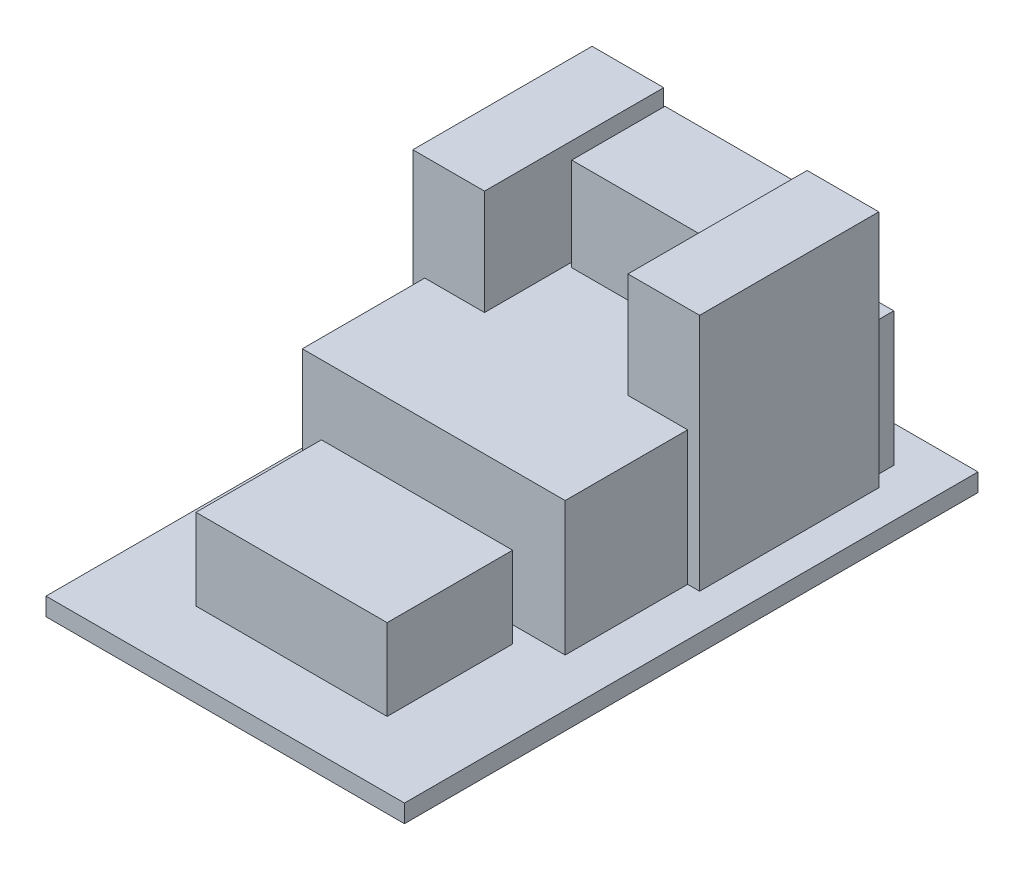
ISO-10303-21;
HEADER;
FILE_DESCRIPTION(('STEP AP214'),'2;1');
FILE_NAME('part.step','',(''),(''),'','','');
FILE_SCHEMA(('AUTOMOTIVE_DESIGN { 1 0 10303 214 1 1 1 1 }'));
ENDSEC;
DATA;
#1=APPLICATION_CONTEXT('core data for automotive mechanical design processes');
#2=APPLICATION_PROTOCOL_DEFINITION('international standard','automotive_design',2000,#1);
#3=PRODUCT_CONTEXT('',#1,'mechanical');
#4=PRODUCT('Part','Part','',(#3));
#5=PRODUCT_RELATED_PRODUCT_CATEGORY('part','',(#4));
#6=PRODUCT_DEFINITION_FORMATION('','',#4);
#7=PRODUCT_DEFINITION_CONTEXT('part definition',#1,'design');
#8=PRODUCT_DEFINITION('design','',#6,#7);
#9=PRODUCT_DEFINITION_SHAPE('','',#8);
#10=(LENGTH_UNIT() NAMED_UNIT(*) SI_UNIT(.MILLI.,.METRE.));
#11=(NAMED_UNIT(*) PLANE_ANGLE_UNIT() SI_UNIT($,.RADIAN.));
#12=(NAMED_UNIT(*) SI_UNIT($,.STERADIAN.) SOLID_ANGLE_UNIT());
#13=UNCERTAINTY_MEASURE_WITH_UNIT(LENGTH_MEASURE(1.E-05),#10,'distance_accuracy_value','');
#14=(GEOMETRIC_REPRESENTATION_CONTEXT(3) GLOBAL_UNCERTAINTY_ASSIGNED_CONTEXT((#13)) GLOBAL_UNIT_ASSIGNED_CONTEXT((#10,
#11,#12)) REPRESENTATION_CONTEXT('',''));
#15=CARTESIAN_POINT('',(0.,0.,0.));
#16=DIRECTION('',(0.,0.,1.));
#17=DIRECTION('',(1.,0.,0.));
#18=AXIS2_PLACEMENT_3D('',#15,#16,#17);
#19=CARTESIAN_POINT('',(0.,112.,0.));
#20=DIRECTION('',(0.,-1.,0.));
#21=DIRECTION('',(0.,0.,-1.));
#22=AXIS2_PLACEMENT_3D('',#19,#20,#21);
#23=PLANE('',#22);
#24=DIRECTION('',(-1.,0.,0.));
#25=VECTOR('',#24,1.);
#26=CARTESIAN_POINT('',(0.,112.,-187.));
#27=LINE('',#26,#25);
#28=CARTESIAN_POINT('',(110.,112.,-187.));
#29=VERTEX_POINT('',#28);
#30=CARTESIAN_POINT('',(60.,112.,-187.));
#31=VERTEX_POINT('',#30);
#32=EDGE_CURVE('E281',#29,#31,#27,.T.);
#33=ORIENTED_EDGE('',*,*,#32,.F.);
#34=DIRECTION('',(0.,0.,-1.));
#35=VECTOR('',#34,1.);
#36=CARTESIAN_POINT('',(110.,112.,65.5));
#37=LINE('',#36,#35);
#38=CARTESIAN_POINT('',(110.,112.,-209.5));
#39=VERTEX_POINT('',#38);
#40=EDGE_CURVE('E358',#29,#39,#37,.T.);
#41=ORIENTED_EDGE('',*,*,#40,.T.);
#42=DIRECTION('',(-1.,0.,0.));
#43=VECTOR('',#42,1.);
#44=CARTESIAN_POINT('',(-110.,112.,-209.5));
#45=LINE('',#44,#43);
#46=CARTESIAN_POINT('',(-110.,112.,-209.5));
#47=VERTEX_POINT('',#46);
#48=EDGE_CURVE('E357',#39,#47,#45,.T.);
#49=ORIENTED_EDGE('',*,*,#48,.T.);
#50=DIRECTION('',(0.,0.,1.));
#51=VECTOR('',#50,1.);
#52=CARTESIAN_POINT('',(-110.,112.,65.5));
#53=LINE('',#52,#51);
#54=CARTESIAN_POINT('',(-110.,112.,-187.));
#55=VERTEX_POINT('',#54);
#56=EDGE_CURVE('E361',#47,#55,#53,.T.);
#57=ORIENTED_EDGE('',*,*,#56,.T.);
#58=DIRECTION('',(-1.,0.,0.));
#59=VECTOR('',#58,1.);
#60=CARTESIAN_POINT('',(0.,112.,-187.));
#61=LINE('',#60,#59);
#62=CARTESIAN_POINT('',(-60.,112.,-187.));
#63=VERTEX_POINT('',#62);
#64=EDGE_CURVE('E428',#63,#55,#61,.T.);
#65=ORIENTED_EDGE('',*,*,#64,.F.);
#66=DIRECTION('',(0.,0.,-1.));
#67=VECTOR('',#66,1.);
#68=CARTESIAN_POINT('',(-60.,112.,0.));
#69=LINE('',#68,#67);
#70=CARTESIAN_POINT('',(-60.,112.,-37.));
#71=VERTEX_POINT('',#70);
#72=EDGE_CURVE('E425',#71,#63,#69,.T.);
#73=ORIENTED_EDGE('',*,*,#72,.F.);
#74=DIRECTION('',(1.,0.,0.));
#75=VECTOR('',#74,1.);
#76=CARTESIAN_POINT('',(0.,112.,-37.));
#77=LINE('',#76,#75);
#78=CARTESIAN_POINT('',(-110.,112.,-37.));
#79=VERTEX_POINT('',#78);
#80=EDGE_CURVE('E417',#79,#71,#77,.T.);
#81=ORIENTED_EDGE('',*,*,#80,.F.);
#82=CARTESIAN_POINT('',(-110.,112.,65.5));
#83=VERTEX_POINT('',#82);
#84=EDGE_CURVE('E360',#79,#83,#53,.T.);
#85=ORIENTED_EDGE('',*,*,#84,.T.);
#86=DIRECTION('',(1.,0.,0.));
#87=VECTOR('',#86,1.);
#88=CARTESIAN_POINT('',(-110.,112.,65.5));
#89=LINE('',#88,#87);
#90=CARTESIAN_POINT('',(110.,112.,65.5));
#91=VERTEX_POINT('',#90);
#92=EDGE_CURVE('E364',#83,#91,#89,.T.);
#93=ORIENTED_EDGE('',*,*,#92,.T.);
#94=CARTESIAN_POINT('',(110.,112.,-37.));
#95=VERTEX_POINT('',#94);
#96=EDGE_CURVE('E354',#91,#95,#37,.T.);
#97=ORIENTED_EDGE('',*,*,#96,.T.);
#98=DIRECTION('',(1.,0.,0.));
#99=VECTOR('',#98,1.);
#100=CARTESIAN_POINT('',(0.,112.,-37.));
#101=LINE('',#100,#99);
#102=CARTESIAN_POINT('',(60.,112.,-37.));
#103=VERTEX_POINT('',#102);
#104=EDGE_CURVE('E278',#103,#95,#101,.T.);
#105=ORIENTED_EDGE('',*,*,#104,.F.);
#106=DIRECTION('',(0.,0.,1.));
#107=VECTOR('',#106,1.);
#108=CARTESIAN_POINT('',(60.,112.,0.));
#109=LINE('',#108,#107);
#110=EDGE_CURVE('E437',#31,#103,#109,.T.);
#111=ORIENTED_EDGE('',*,*,#110,.F.);
#112=EDGE_LOOP('',(#33,#41,#49,#57,#65,#73,#81,#85,#93,#97,#105,#111));
#113=FACE_BOUND('',#112,.T.);
#114=DIRECTION('',(0.,0.,-1.));
#115=VECTOR('',#114,1.);
#116=CARTESIAN_POINT('',(56.,112.,0.));
#117=LINE('',#116,#115);
#118=CARTESIAN_POINT('',(56.,112.,-106.));
#119=VERTEX_POINT('',#118);
#120=CARTESIAN_POINT('',(56.,112.,-184.));
#121=VERTEX_POINT('',#120);
#122=EDGE_CURVE('E11',#119,#121,#117,.T.);
#123=ORIENTED_EDGE('',*,*,#122,.F.);
#124=DIRECTION('',(1.,0.,0.));
#125=VECTOR('',#124,1.);
#126=CARTESIAN_POINT('',(0.,112.,-106.));
#127=LINE('',#126,#125);
#128=CARTESIAN_POINT('',(-56.,112.,-106.));
#129=VERTEX_POINT('',#128);
#130=EDGE_CURVE('E440',#129,#119,#127,.T.);
#131=ORIENTED_EDGE('',*,*,#130,.F.);
#132=DIRECTION('',(0.,0.,1.));
#133=VECTOR('',#132,1.);
#134=CARTESIAN_POINT('',(-56.,112.,0.));
#135=LINE('',#134,#133);
#136=CARTESIAN_POINT('',(-56.,112.,-184.));
#137=VERTEX_POINT('',#136);
#138=EDGE_CURVE('E59',#137,#129,#135,.T.);
#139=ORIENTED_EDGE('',*,*,#138,.F.);
#140=DIRECTION('',(-1.,0.,0.));
#141=VECTOR('',#140,1.);
#142=CARTESIAN_POINT('',(0.,112.,-184.));
#143=LINE('',#142,#141);
#144=EDGE_CURVE('E49',#121,#137,#143,.T.);
#145=ORIENTED_EDGE('',*,*,#144,.F.);
#146=EDGE_LOOP('',(#123,#131,#139,#145));
#147=FACE_BOUND('',#146,.T.);
#148=ADVANCED_FACE('F41',(#113,#147),#23,.F.);
#149=CARTESIAN_POINT('',(0.,0.,0.));
#150=DIRECTION('',(0.,-1.,0.));
#151=DIRECTION('',(0.,0.,-1.));
#152=AXIS2_PLACEMENT_3D('',#149,#150,#151);
#153=PLANE('',#152);
#154=DIRECTION('',(0.,0.,-1.));
#155=VECTOR('',#154,1.);
#156=CARTESIAN_POINT('',(150.,0.,240.));
#157=LINE('',#156,#155);
#158=CARTESIAN_POINT('',(150.,0.,240.));
#159=VERTEX_POINT('',#158);
#160=CARTESIAN_POINT('',(150.,0.,-240.));
#161=VERTEX_POINT('',#160);
#162=EDGE_CURVE('E390',#159,#161,#157,.T.);
#163=ORIENTED_EDGE('',*,*,#162,.T.);
#164=DIRECTION('',(-1.,0.,0.));
#165=VECTOR('',#164,1.);
#166=CARTESIAN_POINT('',(-150.,0.,-240.));
#167=LINE('',#166,#165);
#168=CARTESIAN_POINT('',(-150.,0.,-240.));
#169=VERTEX_POINT('',#168);
#170=EDGE_CURVE('E407',#161,#169,#167,.T.);
#171=ORIENTED_EDGE('',*,*,#170,.T.);
#172=DIRECTION('',(0.,0.,1.));
#173=VECTOR('',#172,1.);
#174=CARTESIAN_POINT('',(-150.,0.,240.));
#175=LINE('',#174,#173);
#176=CARTESIAN_POINT('',(-150.,0.,240.));
#177=VERTEX_POINT('',#176);
#178=EDGE_CURVE('E410',#169,#177,#175,.T.);
#179=ORIENTED_EDGE('',*,*,#178,.T.);
#180=DIRECTION('',(1.,0.,0.));
#181=VECTOR('',#180,1.);
#182=CARTESIAN_POINT('',(-150.,0.,240.));
#183=LINE('',#182,#181);
#184=EDGE_CURVE('E395',#177,#159,#183,.T.);
#185=ORIENTED_EDGE('',*,*,#184,.T.);
#186=EDGE_LOOP('',(#163,#171,#179,#185));
#187=FACE_BOUND('',#186,.T.);
#188=DIRECTION('',(0.,0.,-1.));
#189=VECTOR('',#188,1.);
#190=CARTESIAN_POINT('',(80.,0.,184.5));
#191=LINE('',#190,#189);
#192=CARTESIAN_POINT('',(80.,0.,184.5));
#193=VERTEX_POINT('',#192);
#194=CARTESIAN_POINT('',(80.,0.,79.5));
#195=VERTEX_POINT('',#194);
#196=EDGE_CURVE('E320',#193,#195,#191,.T.);
#197=ORIENTED_EDGE('',*,*,#196,.F.);
#198=DIRECTION('',(1.,0.,0.));
#199=VECTOR('',#198,1.);
#200=CARTESIAN_POINT('',(-80.,0.,184.5));
#201=LINE('',#200,#199);
#202=CARTESIAN_POINT('',(-80.,0.,184.5));
#203=VERTEX_POINT('',#202);
#204=EDGE_CURVE('E325',#203,#193,#201,.T.);
#205=ORIENTED_EDGE('',*,*,#204,.F.);
#206=DIRECTION('',(0.,0.,1.));
#207=VECTOR('',#206,1.);
#208=CARTESIAN_POINT('',(-80.,0.,184.5));
#209=LINE('',#208,#207);
#210=CARTESIAN_POINT('',(-80.,0.,79.5));
#211=VERTEX_POINT('',#210);
#212=EDGE_CURVE('E337',#211,#203,#209,.T.);
#213=ORIENTED_EDGE('',*,*,#212,.F.);
#214=DIRECTION('',(-1.,0.,0.));
#215=VECTOR('',#214,1.);
#216=CARTESIAN_POINT('',(-80.,0.,79.5));
#217=LINE('',#216,#215);
#218=EDGE_CURVE('E334',#195,#211,#217,.T.);
#219=ORIENTED_EDGE('',*,*,#218,.F.);
#220=EDGE_LOOP('',(#197,#205,#213,#219));
#221=FACE_BOUND('',#220,.T.);
#222=DIRECTION('',(-1.,0.,0.));
#223=VECTOR('',#222,1.);
#224=CARTESIAN_POINT('',(60.,0.,-187.));
#225=LINE('',#224,#223);
#226=CARTESIAN_POINT('',(120.,0.,-187.));
#227=VERTEX_POINT('',#226);
#228=CARTESIAN_POINT('',(110.,0.,-187.));
#229=VERTEX_POINT('',#228);
#230=EDGE_CURVE('E246',#227,#229,#225,.T.);
#231=ORIENTED_EDGE('',*,*,#230,.F.);
#232=DIRECTION('',(0.,0.,-1.));
#233=VECTOR('',#232,1.);
#234=CARTESIAN_POINT('',(120.,0.,-37.));
#235=LINE('',#234,#233);
#236=CARTESIAN_POINT('',(120.,0.,-37.));
#237=VERTEX_POINT('',#236);
#238=EDGE_CURVE('E243',#237,#227,#235,.T.);
#239=ORIENTED_EDGE('',*,*,#238,.F.);
#240=DIRECTION('',(1.,0.,0.));
#241=VECTOR('',#240,1.);
#242=CARTESIAN_POINT('',(60.,0.,-37.));
#243=LINE('',#242,#241);
#244=CARTESIAN_POINT('',(110.,0.,-37.));
#245=VERTEX_POINT('',#244);
#246=EDGE_CURVE('E256',#245,#237,#243,.T.);
#247=ORIENTED_EDGE('',*,*,#246,.F.);
#248=DIRECTION('',(0.,0.,-1.));
#249=VECTOR('',#248,1.);
#250=CARTESIAN_POINT('',(110.,0.,65.5));
#251=LINE('',#250,#249);
#252=CARTESIAN_POINT('',(110.,0.,65.5));
#253=VERTEX_POINT('',#252);
#254=EDGE_CURVE('E367',#253,#245,#251,.T.);
#255=ORIENTED_EDGE('',*,*,#254,.F.);
#256=DIRECTION('',(1.,0.,0.));
#257=VECTOR('',#256,1.);
#258=CARTESIAN_POINT('',(-110.,0.,65.5));
#259=LINE('',#258,#257);
#260=CARTESIAN_POINT('',(-110.,0.,65.5));
#261=VERTEX_POINT('',#260);
#262=EDGE_CURVE('E376',#261,#253,#259,.T.);
#263=ORIENTED_EDGE('',*,*,#262,.F.);
#264=DIRECTION('',(0.,0.,1.));
#265=VECTOR('',#264,1.);
#266=CARTESIAN_POINT('',(-110.,0.,65.5));
#267=LINE('',#266,#265);
#268=CARTESIAN_POINT('',(-110.,0.,-37.));
#269=VERTEX_POINT('',#268);
#270=EDGE_CURVE('E372',#269,#261,#267,.T.);
#271=ORIENTED_EDGE('',*,*,#270,.F.);
#272=DIRECTION('',(1.,0.,0.));
#273=VECTOR('',#272,1.);
#274=CARTESIAN_POINT('',(-120.,0.,-37.));
#275=LINE('',#274,#273);
#276=CARTESIAN_POINT('',(-120.,0.,-37.));
#277=VERTEX_POINT('',#276);
#278=EDGE_CURVE('E289',#277,#269,#275,.T.);
#279=ORIENTED_EDGE('',*,*,#278,.F.);
#280=DIRECTION('',(0.,0.,1.));
#281=VECTOR('',#280,1.);
#282=CARTESIAN_POINT('',(-120.,0.,-37.));
#283=LINE('',#282,#281);
#284=CARTESIAN_POINT('',(-120.,0.,-187.));
#285=VERTEX_POINT('',#284);
#286=EDGE_CURVE('E298',#285,#277,#283,.T.);
#287=ORIENTED_EDGE('',*,*,#286,.F.);
#288=DIRECTION('',(-1.,0.,0.));
#289=VECTOR('',#288,1.);
#290=CARTESIAN_POINT('',(-120.,0.,-187.));
#291=LINE('',#290,#289);
#292=CARTESIAN_POINT('',(-110.,0.,-187.));
#293=VERTEX_POINT('',#292);
#294=EDGE_CURVE('E284',#293,#285,#291,.T.);
#295=ORIENTED_EDGE('',*,*,#294,.F.);
#296=CARTESIAN_POINT('',(-110.,0.,-209.5));
#297=VERTEX_POINT('',#296);
#298=EDGE_CURVE('E373',#297,#293,#267,.T.);
#299=ORIENTED_EDGE('',*,*,#298,.F.);
#300=DIRECTION('',(-1.,0.,0.));
#301=VECTOR('',#300,1.);
#302=CARTESIAN_POINT('',(-110.,0.,-209.5));
#303=LINE('',#302,#301);
#304=CARTESIAN_POINT('',(110.,0.,-209.5));
#305=VERTEX_POINT('',#304);
#306=EDGE_CURVE('E369',#305,#297,#303,.T.);
#307=ORIENTED_EDGE('',*,*,#306,.F.);
#308=EDGE_CURVE('E353',#229,#305,#251,.T.);
#309=ORIENTED_EDGE('',*,*,#308,.F.);
#310=EDGE_LOOP('',(#231,#239,#247,#255,#263,#271,#279,#287,#295,#299,#307,#309));
#311=FACE_BOUND('',#310,.T.);
#312=ADVANCED_FACE('F454',(#187,#221,#311),#153,.F.);
#313=CARTESIAN_POINT('',(110.,112.,65.5));
#314=DIRECTION('',(-1.,0.,0.));
#315=DIRECTION('',(0.,0.,1.));
#316=AXIS2_PLACEMENT_3D('',#313,#314,#315);
#317=PLANE('',#316);
#318=DIRECTION('',(0.,1.,0.));
#319=VECTOR('',#318,1.);
#320=CARTESIAN_POINT('',(110.,112.,-187.));
#321=LINE('',#320,#319);
#322=EDGE_CURVE('E434',#229,#29,#321,.T.);
#323=ORIENTED_EDGE('',*,*,#322,.F.);
#324=ORIENTED_EDGE('',*,*,#308,.T.);
#325=DIRECTION('',(0.,-1.,0.));
#326=VECTOR('',#325,1.);
#327=CARTESIAN_POINT('',(110.,112.,-209.5));
#328=LINE('',#327,#326);
#329=EDGE_CURVE('E387',#39,#305,#328,.T.);
#330=ORIENTED_EDGE('',*,*,#329,.F.);
#331=ORIENTED_EDGE('',*,*,#40,.F.);
#332=EDGE_LOOP('',(#323,#324,#330,#331));
#333=FACE_BOUND('',#332,.T.);
#334=ADVANCED_FACE('F462',(#333),#317,.F.);
#335=DIRECTION('',(0.,-1.,0.));
#336=VECTOR('',#335,1.);
#337=CARTESIAN_POINT('',(110.,112.,-37.));
#338=LINE('',#337,#336);
#339=EDGE_CURVE('E431',#95,#245,#338,.T.);
#340=ORIENTED_EDGE('',*,*,#339,.F.);
#341=ORIENTED_EDGE('',*,*,#96,.F.);
#342=DIRECTION('',(0.,-1.,0.));
#343=VECTOR('',#342,1.);
#344=CARTESIAN_POINT('',(110.,112.,65.5));
#345=LINE('',#344,#343);
#346=EDGE_CURVE('E366',#91,#253,#345,.T.);
#347=ORIENTED_EDGE('',*,*,#346,.T.);
#348=ORIENTED_EDGE('',*,*,#254,.T.);
#349=EDGE_LOOP('',(#340,#341,#347,#348));
#350=FACE_BOUND('',#349,.T.);
#351=ADVANCED_FACE('F478',(#350),#317,.F.);
#352=CARTESIAN_POINT('',(-110.,112.,65.5));
#353=DIRECTION('',(1.,0.,0.));
#354=DIRECTION('',(0.,0.,-1.));
#355=AXIS2_PLACEMENT_3D('',#352,#353,#354);
#356=PLANE('',#355);
#357=DIRECTION('',(0.,-1.,0.));
#358=VECTOR('',#357,1.);
#359=CARTESIAN_POINT('',(-110.,112.,-187.));
#360=LINE('',#359,#358);
#361=EDGE_CURVE('E317',#55,#293,#360,.T.);
#362=ORIENTED_EDGE('',*,*,#361,.F.);
#363=ORIENTED_EDGE('',*,*,#56,.F.);
#364=DIRECTION('',(0.,-1.,0.));
#365=VECTOR('',#364,1.);
#366=CARTESIAN_POINT('',(-110.,112.,-209.5));
#367=LINE('',#366,#365);
#368=EDGE_CURVE('E384',#47,#297,#367,.T.);
#369=ORIENTED_EDGE('',*,*,#368,.T.);
#370=ORIENTED_EDGE('',*,*,#298,.T.);
#371=EDGE_LOOP('',(#362,#363,#369,#370));
#372=FACE_BOUND('',#371,.T.);
#373=ADVANCED_FACE('F474',(#372),#356,.F.);
#374=DIRECTION('',(0.,1.,0.));
#375=VECTOR('',#374,1.);
#376=CARTESIAN_POINT('',(-110.,112.,-37.));
#377=LINE('',#376,#375);
#378=EDGE_CURVE('E314',#269,#79,#377,.T.);
#379=ORIENTED_EDGE('',*,*,#378,.F.);
#380=ORIENTED_EDGE('',*,*,#270,.T.);
#381=DIRECTION('',(0.,-1.,0.));
#382=VECTOR('',#381,1.);
#383=CARTESIAN_POINT('',(-110.,112.,65.5));
#384=LINE('',#383,#382);
#385=EDGE_CURVE('E381',#83,#261,#384,.T.);
#386=ORIENTED_EDGE('',*,*,#385,.F.);
#387=ORIENTED_EDGE('',*,*,#84,.F.);
#388=EDGE_LOOP('',(#379,#380,#386,#387));
#389=FACE_BOUND('',#388,.T.);
#390=ADVANCED_FACE('F477',(#389),#356,.F.);
#391=CARTESIAN_POINT('',(150.,-15.,240.));
#392=DIRECTION('',(1.,0.,0.));
#393=DIRECTION('',(0.,0.,-1.));
#394=AXIS2_PLACEMENT_3D('',#391,#392,#393);
#395=PLANE('',#394);
#396=ORIENTED_EDGE('',*,*,#162,.F.);
#397=DIRECTION('',(0.,1.,0.));
#398=VECTOR('',#397,1.);
#399=CARTESIAN_POINT('',(150.,-15.,240.));
#400=LINE('',#399,#398);
#401=CARTESIAN_POINT('',(150.,-15.,240.));
#402=VERTEX_POINT('',#401);
#403=EDGE_CURVE('E415',#402,#159,#400,.T.);
#404=ORIENTED_EDGE('',*,*,#403,.F.);
#405=DIRECTION('',(0.,0.,-1.));
#406=VECTOR('',#405,1.);
#407=CARTESIAN_POINT('',(150.,-15.,240.));
#408=LINE('',#407,#406);
#409=CARTESIAN_POINT('',(150.,-15.,-240.));
#410=VERTEX_POINT('',#409);
#411=EDGE_CURVE('E391',#402,#410,#408,.T.);
#412=ORIENTED_EDGE('',*,*,#411,.T.);
#413=DIRECTION('',(0.,1.,0.));
#414=VECTOR('',#413,1.);
#415=CARTESIAN_POINT('',(150.,-15.,-240.));
#416=LINE('',#415,#414);
#417=EDGE_CURVE('E404',#410,#161,#416,.T.);
#418=ORIENTED_EDGE('',*,*,#417,.T.);
#419=EDGE_LOOP('',(#396,#404,#412,#418));
#420=FACE_BOUND('',#419,.T.);
#421=ADVANCED_FACE('F43',(#420),#395,.T.);
#422=CARTESIAN_POINT('',(-150.,-15.,240.));
#423=DIRECTION('',(0.,0.,1.));
#424=DIRECTION('',(1.,0.,0.));
#425=AXIS2_PLACEMENT_3D('',#422,#423,#424);
#426=PLANE('',#425);
#427=ORIENTED_EDGE('',*,*,#184,.F.);
#428=DIRECTION('',(0.,1.,0.));
#429=VECTOR('',#428,1.);
#430=CARTESIAN_POINT('',(-150.,-15.,240.));
#431=LINE('',#430,#429);
#432=CARTESIAN_POINT('',(-150.,-15.,240.));
#433=VERTEX_POINT('',#432);
#434=EDGE_CURVE('E418',#433,#177,#431,.T.);
#435=ORIENTED_EDGE('',*,*,#434,.F.);
#436=DIRECTION('',(1.,0.,0.));
#437=VECTOR('',#436,1.);
#438=CARTESIAN_POINT('',(-150.,-15.,240.));
#439=LINE('',#438,#437);
#440=EDGE_CURVE('E401',#433,#402,#439,.T.);
#441=ORIENTED_EDGE('',*,*,#440,.T.);
#442=ORIENTED_EDGE('',*,*,#403,.T.);
#443=EDGE_LOOP('',(#427,#435,#441,#442));
#444=FACE_BOUND('',#443,.T.);
#445=ADVANCED_FACE('F491',(#444),#426,.T.);
#446=CARTESIAN_POINT('',(-150.,-15.,240.));
#447=DIRECTION('',(-1.,0.,0.));
#448=DIRECTION('',(0.,0.,1.));
#449=AXIS2_PLACEMENT_3D('',#446,#447,#448);
#450=PLANE('',#449);
#451=ORIENTED_EDGE('',*,*,#178,.F.);
#452=DIRECTION('',(0.,1.,0.));
#453=VECTOR('',#452,1.);
#454=CARTESIAN_POINT('',(-150.,-15.,-240.));
#455=LINE('',#454,#453);
#456=CARTESIAN_POINT('',(-150.,-15.,-240.));
#457=VERTEX_POINT('',#456);
#458=EDGE_CURVE('E420',#457,#169,#455,.T.);
#459=ORIENTED_EDGE('',*,*,#458,.F.);
#460=DIRECTION('',(0.,0.,1.));
#461=VECTOR('',#460,1.);
#462=CARTESIAN_POINT('',(-150.,-15.,240.));
#463=LINE('',#462,#461);
#464=EDGE_CURVE('E398',#457,#433,#463,.T.);
#465=ORIENTED_EDGE('',*,*,#464,.T.);
#466=ORIENTED_EDGE('',*,*,#434,.T.);
#467=EDGE_LOOP('',(#451,#459,#465,#466));
#468=FACE_BOUND('',#467,.T.);
#469=ADVANCED_FACE('F494',(#468),#450,.T.);
#470=CARTESIAN_POINT('',(-150.,-15.,-240.));
#471=DIRECTION('',(0.,0.,-1.));
#472=DIRECTION('',(-1.,0.,0.));
#473=AXIS2_PLACEMENT_3D('',#470,#471,#472);
#474=PLANE('',#473);
#475=ORIENTED_EDGE('',*,*,#170,.F.);
#476=ORIENTED_EDGE('',*,*,#417,.F.);
#477=DIRECTION('',(-1.,0.,0.));
#478=VECTOR('',#477,1.);
#479=CARTESIAN_POINT('',(-150.,-15.,-240.));
#480=LINE('',#479,#478);
#481=EDGE_CURVE('E394',#410,#457,#480,.T.);
#482=ORIENTED_EDGE('',*,*,#481,.T.);
#483=ORIENTED_EDGE('',*,*,#458,.T.);
#484=EDGE_LOOP('',(#475,#476,#482,#483));
#485=FACE_BOUND('',#484,.T.);
#486=ADVANCED_FACE('F488',(#485),#474,.T.);
#487=CARTESIAN_POINT('',(0.,-15.,0.));
#488=DIRECTION('',(0.,-1.,0.));
#489=DIRECTION('',(0.,0.,-1.));
#490=AXIS2_PLACEMENT_3D('',#487,#488,#489);
#491=PLANE('',#490);
#492=ORIENTED_EDGE('',*,*,#411,.F.);
#493=ORIENTED_EDGE('',*,*,#440,.F.);
#494=ORIENTED_EDGE('',*,*,#464,.F.);
#495=ORIENTED_EDGE('',*,*,#481,.F.);
#496=EDGE_LOOP('',(#492,#493,#494,#495));
#497=FACE_BOUND('',#496,.T.);
#498=ADVANCED_FACE('F482',(#497),#491,.T.);
#499=CARTESIAN_POINT('',(-110.,112.,-209.5));
#500=DIRECTION('',(0.,0.,1.));
#501=DIRECTION('',(1.,0.,0.));
#502=AXIS2_PLACEMENT_3D('',#499,#500,#501);
#503=PLANE('',#502);
#504=ORIENTED_EDGE('',*,*,#306,.T.);
#505=ORIENTED_EDGE('',*,*,#368,.F.);
#506=ORIENTED_EDGE('',*,*,#48,.F.);
#507=ORIENTED_EDGE('',*,*,#329,.T.);
#508=EDGE_LOOP('',(#504,#505,#506,#507));
#509=FACE_BOUND('',#508,.T.);
#510=ADVANCED_FACE('F472',(#509),#503,.F.);
#511=CARTESIAN_POINT('',(-110.,112.,65.5));
#512=DIRECTION('',(0.,0.,-1.));
#513=DIRECTION('',(-1.,0.,0.));
#514=AXIS2_PLACEMENT_3D('',#511,#512,#513);
#515=PLANE('',#514);
#516=ORIENTED_EDGE('',*,*,#262,.T.);
#517=ORIENTED_EDGE('',*,*,#346,.F.);
#518=ORIENTED_EDGE('',*,*,#92,.F.);
#519=ORIENTED_EDGE('',*,*,#385,.T.);
#520=EDGE_LOOP('',(#516,#517,#518,#519));
#521=FACE_BOUND('',#520,.T.);
#522=ADVANCED_FACE('F469',(#521),#515,.F.);
#523=CARTESIAN_POINT('',(80.,68.,184.5));
#524=DIRECTION('',(-1.,0.,0.));
#525=DIRECTION('',(0.,0.,1.));
#526=AXIS2_PLACEMENT_3D('',#523,#524,#525);
#527=PLANE('',#526);
#528=ORIENTED_EDGE('',*,*,#196,.T.);
#529=DIRECTION('',(0.,-1.,0.));
#530=VECTOR('',#529,1.);
#531=CARTESIAN_POINT('',(80.,68.,79.5));
#532=LINE('',#531,#530);
#533=CARTESIAN_POINT('',(80.,68.,79.5));
#534=VERTEX_POINT('',#533);
#535=EDGE_CURVE('E350',#534,#195,#532,.T.);
#536=ORIENTED_EDGE('',*,*,#535,.F.);
#537=DIRECTION('',(0.,0.,-1.));
#538=VECTOR('',#537,1.);
#539=CARTESIAN_POINT('',(80.,68.,184.5));
#540=LINE('',#539,#538);
#541=CARTESIAN_POINT('',(80.,68.,184.5));
#542=VERTEX_POINT('',#541);
#543=EDGE_CURVE('E321',#542,#534,#540,.T.);
#544=ORIENTED_EDGE('',*,*,#543,.F.);
#545=DIRECTION('',(0.,-1.,0.));
#546=VECTOR('',#545,1.);
#547=CARTESIAN_POINT('',(80.,68.,184.5));
#548=LINE('',#547,#546);
#549=EDGE_CURVE('E331',#542,#193,#548,.T.);
#550=ORIENTED_EDGE('',*,*,#549,.T.);
#551=EDGE_LOOP('',(#528,#536,#544,#550));
#552=FACE_BOUND('',#551,.T.);
#553=ADVANCED_FACE('F467',(#552),#527,.F.);
#554=CARTESIAN_POINT('',(-80.,68.,79.5));
#555=DIRECTION('',(0.,0.,1.));
#556=DIRECTION('',(1.,0.,0.));
#557=AXIS2_PLACEMENT_3D('',#554,#555,#556);
#558=PLANE('',#557);
#559=ORIENTED_EDGE('',*,*,#218,.T.);
#560=DIRECTION('',(0.,-1.,0.));
#561=VECTOR('',#560,1.);
#562=CARTESIAN_POINT('',(-80.,68.,79.5));
#563=LINE('',#562,#561);
#564=CARTESIAN_POINT('',(-80.,68.,79.5));
#565=VERTEX_POINT('',#564);
#566=EDGE_CURVE('E347',#565,#211,#563,.T.);
#567=ORIENTED_EDGE('',*,*,#566,.F.);
#568=DIRECTION('',(-1.,0.,0.));
#569=VECTOR('',#568,1.);
#570=CARTESIAN_POINT('',(-80.,68.,79.5));
#571=LINE('',#570,#569);
#572=EDGE_CURVE('E324',#534,#565,#571,.T.);
#573=ORIENTED_EDGE('',*,*,#572,.F.);
#574=ORIENTED_EDGE('',*,*,#535,.T.);
#575=EDGE_LOOP('',(#559,#567,#573,#574));
#576=FACE_BOUND('',#575,.T.);
#577=ADVANCED_FACE('F593',(#576),#558,.F.);
#578=CARTESIAN_POINT('',(-80.,68.,184.5));
#579=DIRECTION('',(1.,0.,0.));
#580=DIRECTION('',(0.,0.,-1.));
#581=AXIS2_PLACEMENT_3D('',#578,#579,#580);
#582=PLANE('',#581);
#583=ORIENTED_EDGE('',*,*,#212,.T.);
#584=DIRECTION('',(0.,-1.,0.));
#585=VECTOR('',#584,1.);
#586=CARTESIAN_POINT('',(-80.,68.,184.5));
#587=LINE('',#586,#585);
#588=CARTESIAN_POINT('',(-80.,68.,184.5));
#589=VERTEX_POINT('',#588);
#590=EDGE_CURVE('E344',#589,#203,#587,.T.);
#591=ORIENTED_EDGE('',*,*,#590,.F.);
#592=DIRECTION('',(0.,0.,1.));
#593=VECTOR('',#592,1.);
#594=CARTESIAN_POINT('',(-80.,68.,184.5));
#595=LINE('',#594,#593);
#596=EDGE_CURVE('E327',#565,#589,#595,.T.);
#597=ORIENTED_EDGE('',*,*,#596,.F.);
#598=ORIENTED_EDGE('',*,*,#566,.T.);
#599=EDGE_LOOP('',(#583,#591,#597,#598));
#600=FACE_BOUND('',#599,.T.);
#601=ADVANCED_FACE('F590',(#600),#582,.F.);
#602=CARTESIAN_POINT('',(-80.,68.,184.5));
#603=DIRECTION('',(0.,0.,-1.));
#604=DIRECTION('',(-1.,0.,0.));
#605=AXIS2_PLACEMENT_3D('',#602,#603,#604);
#606=PLANE('',#605);
#607=ORIENTED_EDGE('',*,*,#204,.T.);
#608=ORIENTED_EDGE('',*,*,#549,.F.);
#609=DIRECTION('',(1.,0.,0.));
#610=VECTOR('',#609,1.);
#611=CARTESIAN_POINT('',(-80.,68.,184.5));
#612=LINE('',#611,#610);
#613=EDGE_CURVE('E329',#589,#542,#612,.T.);
#614=ORIENTED_EDGE('',*,*,#613,.F.);
#615=ORIENTED_EDGE('',*,*,#590,.T.);
#616=EDGE_LOOP('',(#607,#608,#614,#615));
#617=FACE_BOUND('',#616,.T.);
#618=ADVANCED_FACE('F586',(#617),#606,.F.);
#619=CARTESIAN_POINT('',(0.,68.,0.));
#620=DIRECTION('',(0.,-1.,0.));
#621=DIRECTION('',(0.,0.,-1.));
#622=AXIS2_PLACEMENT_3D('',#619,#620,#621);
#623=PLANE('',#622);
#624=ORIENTED_EDGE('',*,*,#543,.T.);
#625=ORIENTED_EDGE('',*,*,#572,.T.);
#626=ORIENTED_EDGE('',*,*,#596,.T.);
#627=ORIENTED_EDGE('',*,*,#613,.T.);
#628=EDGE_LOOP('',(#624,#625,#626,#627));
#629=FACE_BOUND('',#628,.T.);
#630=ADVANCED_FACE('F583',(#629),#623,.F.);
#631=CARTESIAN_POINT('',(-60.,200.,-37.));
#632=DIRECTION('',(-1.,0.,0.));
#633=DIRECTION('',(0.,0.,1.));
#634=AXIS2_PLACEMENT_3D('',#631,#632,#633);
#635=PLANE('',#634);
#636=DIRECTION('',(0.,-1.,0.));
#637=VECTOR('',#636,1.);
#638=CARTESIAN_POINT('',(-60.,200.,-37.));
#639=LINE('',#638,#637);
#640=CARTESIAN_POINT('',(-60.,200.,-37.));
#641=VERTEX_POINT('',#640);
#642=EDGE_CURVE('E295',#641,#71,#639,.T.);
#643=ORIENTED_EDGE('',*,*,#642,.T.);
#644=ORIENTED_EDGE('',*,*,#72,.T.);
#645=DIRECTION('',(0.,-1.,0.));
#646=VECTOR('',#645,1.);
#647=CARTESIAN_POINT('',(-60.,200.,-187.));
#648=LINE('',#647,#646);
#649=CARTESIAN_POINT('',(-60.,200.,-187.));
#650=VERTEX_POINT('',#649);
#651=EDGE_CURVE('E311',#650,#63,#648,.T.);
#652=ORIENTED_EDGE('',*,*,#651,.F.);
#653=DIRECTION('',(0.,0.,-1.));
#654=VECTOR('',#653,1.);
#655=CARTESIAN_POINT('',(-60.,200.,-37.));
#656=LINE('',#655,#654);
#657=EDGE_CURVE('E285',#641,#650,#656,.T.);
#658=ORIENTED_EDGE('',*,*,#657,.F.);
#659=EDGE_LOOP('',(#643,#644,#652,#658));
#660=FACE_BOUND('',#659,.T.);
#661=ADVANCED_FACE('F561',(#660),#635,.F.);
#662=CARTESIAN_POINT('',(-120.,200.,-187.));
#663=DIRECTION('',(0.,0.,1.));
#664=DIRECTION('',(1.,0.,0.));
#665=AXIS2_PLACEMENT_3D('',#662,#663,#664);
#666=PLANE('',#665);
#667=ORIENTED_EDGE('',*,*,#64,.T.);
#668=ORIENTED_EDGE('',*,*,#361,.T.);
#669=ORIENTED_EDGE('',*,*,#294,.T.);
#670=DIRECTION('',(0.,-1.,0.));
#671=VECTOR('',#670,1.);
#672=CARTESIAN_POINT('',(-120.,200.,-187.));
#673=LINE('',#672,#671);
#674=CARTESIAN_POINT('',(-120.,200.,-187.));
#675=VERTEX_POINT('',#674);
#676=EDGE_CURVE('E308',#675,#285,#673,.T.);
#677=ORIENTED_EDGE('',*,*,#676,.F.);
#678=DIRECTION('',(-1.,0.,0.));
#679=VECTOR('',#678,1.);
#680=CARTESIAN_POINT('',(-120.,200.,-187.));
#681=LINE('',#680,#679);
#682=EDGE_CURVE('E288',#650,#675,#681,.T.);
#683=ORIENTED_EDGE('',*,*,#682,.F.);
#684=ORIENTED_EDGE('',*,*,#651,.T.);
#685=EDGE_LOOP('',(#667,#668,#669,#677,#683,#684));
#686=FACE_BOUND('',#685,.T.);
#687=ADVANCED_FACE('F535',(#686),#666,.F.);
#688=CARTESIAN_POINT('',(-120.,200.,-37.));
#689=DIRECTION('',(0.,0.,-1.));
#690=DIRECTION('',(-1.,0.,0.));
#691=AXIS2_PLACEMENT_3D('',#688,#689,#690);
#692=PLANE('',#691);
#693=ORIENTED_EDGE('',*,*,#278,.T.);
#694=ORIENTED_EDGE('',*,*,#378,.T.);
#695=ORIENTED_EDGE('',*,*,#80,.T.);
#696=ORIENTED_EDGE('',*,*,#642,.F.);
#697=DIRECTION('',(1.,0.,0.));
#698=VECTOR('',#697,1.);
#699=CARTESIAN_POINT('',(-120.,200.,-37.));
#700=LINE('',#699,#698);
#701=CARTESIAN_POINT('',(-120.,200.,-37.));
#702=VERTEX_POINT('',#701);
#703=EDGE_CURVE('E293',#702,#641,#700,.T.);
#704=ORIENTED_EDGE('',*,*,#703,.F.);
#705=DIRECTION('',(0.,-1.,0.));
#706=VECTOR('',#705,1.);
#707=CARTESIAN_POINT('',(-120.,200.,-37.));
#708=LINE('',#707,#706);
#709=EDGE_CURVE('E305',#702,#277,#708,.T.);
#710=ORIENTED_EDGE('',*,*,#709,.T.);
#711=EDGE_LOOP('',(#693,#694,#695,#696,#704,#710));
#712=FACE_BOUND('',#711,.T.);
#713=ADVANCED_FACE('F526',(#712),#692,.F.);
#714=CARTESIAN_POINT('',(-120.,200.,-37.));
#715=DIRECTION('',(1.,0.,0.));
#716=DIRECTION('',(0.,0.,-1.));
#717=AXIS2_PLACEMENT_3D('',#714,#715,#716);
#718=PLANE('',#717);
#719=ORIENTED_EDGE('',*,*,#286,.T.);
#720=ORIENTED_EDGE('',*,*,#709,.F.);
#721=DIRECTION('',(0.,0.,1.));
#722=VECTOR('',#721,1.);
#723=CARTESIAN_POINT('',(-120.,200.,-37.));
#724=LINE('',#723,#722);
#725=EDGE_CURVE('E291',#675,#702,#724,.T.);
#726=ORIENTED_EDGE('',*,*,#725,.F.);
#727=ORIENTED_EDGE('',*,*,#676,.T.);
#728=EDGE_LOOP('',(#719,#720,#726,#727));
#729=FACE_BOUND('',#728,.T.);
#730=ADVANCED_FACE('F532',(#729),#718,.F.);
#731=CARTESIAN_POINT('',(0.,200.,0.));
#732=DIRECTION('',(0.,-1.,0.));
#733=DIRECTION('',(0.,0.,-1.));
#734=AXIS2_PLACEMENT_3D('',#731,#732,#733);
#735=PLANE('',#734);
#736=ORIENTED_EDGE('',*,*,#657,.T.);
#737=ORIENTED_EDGE('',*,*,#682,.T.);
#738=ORIENTED_EDGE('',*,*,#725,.T.);
#739=ORIENTED_EDGE('',*,*,#703,.T.);
#740=EDGE_LOOP('',(#736,#737,#738,#739));
#741=FACE_BOUND('',#740,.T.);
#742=ADVANCED_FACE('F564',(#741),#735,.F.);
#743=CARTESIAN_POINT('',(60.,200.,-37.));
#744=DIRECTION('',(1.,0.,0.));
#745=DIRECTION('',(0.,0.,-1.));
#746=AXIS2_PLACEMENT_3D('',#743,#744,#745);
#747=PLANE('',#746);
#748=DIRECTION('',(0.,-1.,0.));
#749=VECTOR('',#748,1.);
#750=CARTESIAN_POINT('',(60.,200.,-187.));
#751=LINE('',#750,#749);
#752=CARTESIAN_POINT('',(60.,200.,-187.));
#753=VERTEX_POINT('',#752);
#754=EDGE_CURVE('E272',#753,#31,#751,.T.);
#755=ORIENTED_EDGE('',*,*,#754,.T.);
#756=ORIENTED_EDGE('',*,*,#110,.T.);
#757=DIRECTION('',(0.,-1.,0.));
#758=VECTOR('',#757,1.);
#759=CARTESIAN_POINT('',(60.,200.,-37.));
#760=LINE('',#759,#758);
#761=CARTESIAN_POINT('',(60.,200.,-37.));
#762=VERTEX_POINT('',#761);
#763=EDGE_CURVE('E269',#762,#103,#760,.T.);
#764=ORIENTED_EDGE('',*,*,#763,.F.);
#765=DIRECTION('',(0.,0.,1.));
#766=VECTOR('',#765,1.);
#767=CARTESIAN_POINT('',(60.,200.,-37.));
#768=LINE('',#767,#766);
#769=EDGE_CURVE('E258',#753,#762,#768,.T.);
#770=ORIENTED_EDGE('',*,*,#769,.F.);
#771=EDGE_LOOP('',(#755,#756,#764,#770));
#772=FACE_BOUND('',#771,.T.);
#773=ADVANCED_FACE('F566',(#772),#747,.F.);
#774=CARTESIAN_POINT('',(60.,200.,-187.));
#775=DIRECTION('',(0.,0.,1.));
#776=DIRECTION('',(1.,0.,0.));
#777=AXIS2_PLACEMENT_3D('',#774,#775,#776);
#778=PLANE('',#777);
#779=ORIENTED_EDGE('',*,*,#322,.T.);
#780=ORIENTED_EDGE('',*,*,#32,.T.);
#781=ORIENTED_EDGE('',*,*,#754,.F.);
#782=DIRECTION('',(-1.,0.,0.));
#783=VECTOR('',#782,1.);
#784=CARTESIAN_POINT('',(60.,200.,-187.));
#785=LINE('',#784,#783);
#786=CARTESIAN_POINT('',(120.,200.,-187.));
#787=VERTEX_POINT('',#786);
#788=EDGE_CURVE('E255',#787,#753,#785,.T.);
#789=ORIENTED_EDGE('',*,*,#788,.F.);
#790=DIRECTION('',(0.,-1.,0.));
#791=VECTOR('',#790,1.);
#792=CARTESIAN_POINT('',(120.,200.,-187.));
#793=LINE('',#792,#791);
#794=EDGE_CURVE('E275',#787,#227,#793,.T.);
#795=ORIENTED_EDGE('',*,*,#794,.T.);
#796=ORIENTED_EDGE('',*,*,#230,.T.);
#797=EDGE_LOOP('',(#779,#780,#781,#789,#795,#796));
#798=FACE_BOUND('',#797,.T.);
#799=ADVANCED_FACE('F544',(#798),#778,.F.);
#800=CARTESIAN_POINT('',(60.,200.,-37.));
#801=DIRECTION('',(0.,0.,-1.));
#802=DIRECTION('',(-1.,0.,0.));
#803=AXIS2_PLACEMENT_3D('',#800,#801,#802);
#804=PLANE('',#803);
#805=ORIENTED_EDGE('',*,*,#763,.T.);
#806=ORIENTED_EDGE('',*,*,#104,.T.);
#807=ORIENTED_EDGE('',*,*,#339,.T.);
#808=ORIENTED_EDGE('',*,*,#246,.T.);
#809=DIRECTION('',(0.,-1.,0.));
#810=VECTOR('',#809,1.);
#811=CARTESIAN_POINT('',(120.,200.,-37.));
#812=LINE('',#811,#810);
#813=CARTESIAN_POINT('',(120.,200.,-37.));
#814=VERTEX_POINT('',#813);
#815=EDGE_CURVE('E261',#814,#237,#812,.T.);
#816=ORIENTED_EDGE('',*,*,#815,.F.);
#817=DIRECTION('',(1.,0.,0.));
#818=VECTOR('',#817,1.);
#819=CARTESIAN_POINT('',(60.,200.,-37.));
#820=LINE('',#819,#818);
#821=EDGE_CURVE('E260',#762,#814,#820,.T.);
#822=ORIENTED_EDGE('',*,*,#821,.F.);
#823=EDGE_LOOP('',(#805,#806,#807,#808,#816,#822));
#824=FACE_BOUND('',#823,.T.);
#825=ADVANCED_FACE('F553',(#824),#804,.F.);
#826=CARTESIAN_POINT('',(120.,200.,-37.));
#827=DIRECTION('',(-1.,0.,0.));
#828=DIRECTION('',(0.,0.,1.));
#829=AXIS2_PLACEMENT_3D('',#826,#827,#828);
#830=PLANE('',#829);
#831=ORIENTED_EDGE('',*,*,#238,.T.);
#832=ORIENTED_EDGE('',*,*,#794,.F.);
#833=DIRECTION('',(0.,0.,-1.));
#834=VECTOR('',#833,1.);
#835=CARTESIAN_POINT('',(120.,200.,-37.));
#836=LINE('',#835,#834);
#837=EDGE_CURVE('E252',#814,#787,#836,.T.);
#838=ORIENTED_EDGE('',*,*,#837,.F.);
#839=ORIENTED_EDGE('',*,*,#815,.T.);
#840=EDGE_LOOP('',(#831,#832,#838,#839));
#841=FACE_BOUND('',#840,.T.);
#842=ADVANCED_FACE('F549',(#841),#830,.F.);
#843=CARTESIAN_POINT('',(0.,200.,0.));
#844=DIRECTION('',(0.,-1.,0.));
#845=DIRECTION('',(0.,0.,-1.));
#846=AXIS2_PLACEMENT_3D('',#843,#844,#845);
#847=PLANE('',#846);
#848=ORIENTED_EDGE('',*,*,#837,.T.);
#849=ORIENTED_EDGE('',*,*,#788,.T.);
#850=ORIENTED_EDGE('',*,*,#769,.T.);
#851=ORIENTED_EDGE('',*,*,#821,.T.);
#852=EDGE_LOOP('',(#848,#849,#850,#851));
#853=FACE_BOUND('',#852,.T.);
#854=ADVANCED_FACE('F746',(#853),#847,.F.);
#855=CARTESIAN_POINT('',(56.,190.,-106.));
#856=DIRECTION('',(-1.,0.,0.));
#857=DIRECTION('',(0.,0.,1.));
#858=AXIS2_PLACEMENT_3D('',#855,#856,#857);
#859=PLANE('',#858);
#860=DIRECTION('',(0.,-1.,0.));
#861=VECTOR('',#860,1.);
#862=CARTESIAN_POINT('',(56.,190.,-106.));
#863=LINE('',#862,#861);
#864=CARTESIAN_POINT('',(56.,190.,-106.));
#865=VERTEX_POINT('',#864);
#866=EDGE_CURVE('E448',#865,#119,#863,.T.);
#867=ORIENTED_EDGE('',*,*,#866,.T.);
#868=ORIENTED_EDGE('',*,*,#122,.T.);
#869=DIRECTION('',(0.,-1.,0.));
#870=VECTOR('',#869,1.);
#871=CARTESIAN_POINT('',(56.,190.,-184.));
#872=LINE('',#871,#870);
#873=CARTESIAN_POINT('',(56.,190.,-184.));
#874=VERTEX_POINT('',#873);
#875=EDGE_CURVE('E226',#874,#121,#872,.T.);
#876=ORIENTED_EDGE('',*,*,#875,.F.);
#877=DIRECTION('',(0.,0.,-1.));
#878=VECTOR('',#877,1.);
#879=CARTESIAN_POINT('',(56.,190.,-106.));
#880=LINE('',#879,#878);
#881=EDGE_CURVE('E232',#865,#874,#880,.T.);
#882=ORIENTED_EDGE('',*,*,#881,.F.);
#883=EDGE_LOOP('',(#867,#868,#876,#882));
#884=FACE_BOUND('',#883,.T.);
#885=ADVANCED_FACE('F242',(#884),#859,.F.);
#886=CARTESIAN_POINT('',(-56.,190.,-184.));
#887=DIRECTION('',(0.,0.,1.));
#888=DIRECTION('',(1.,0.,0.));
#889=AXIS2_PLACEMENT_3D('',#886,#887,#888);
#890=PLANE('',#889);
#891=ORIENTED_EDGE('',*,*,#875,.T.);
#892=ORIENTED_EDGE('',*,*,#144,.T.);
#893=DIRECTION('',(0.,-1.,0.));
#894=VECTOR('',#893,1.);
#895=CARTESIAN_POINT('',(-56.,190.,-184.));
#896=LINE('',#895,#894);
#897=CARTESIAN_POINT('',(-56.,190.,-184.));
#898=VERTEX_POINT('',#897);
#899=EDGE_CURVE('E228',#898,#137,#896,.T.);
#900=ORIENTED_EDGE('',*,*,#899,.F.);
#901=DIRECTION('',(-1.,0.,0.));
#902=VECTOR('',#901,1.);
#903=CARTESIAN_POINT('',(-56.,190.,-184.));
#904=LINE('',#903,#902);
#905=EDGE_CURVE('E222',#874,#898,#904,.T.);
#906=ORIENTED_EDGE('',*,*,#905,.F.);
#907=EDGE_LOOP('',(#891,#892,#900,#906));
#908=FACE_BOUND('',#907,.T.);
#909=ADVANCED_FACE('F224',(#908),#890,.F.);
#910=CARTESIAN_POINT('',(-56.,190.,-106.));
#911=DIRECTION('',(1.,0.,0.));
#912=DIRECTION('',(0.,0.,-1.));
#913=AXIS2_PLACEMENT_3D('',#910,#911,#912);
#914=PLANE('',#913);
#915=ORIENTED_EDGE('',*,*,#899,.T.);
#916=ORIENTED_EDGE('',*,*,#138,.T.);
#917=DIRECTION('',(0.,-1.,0.));
#918=VECTOR('',#917,1.);
#919=CARTESIAN_POINT('',(-56.,190.,-106.));
#920=LINE('',#919,#918);
#921=CARTESIAN_POINT('',(-56.,190.,-106.));
#922=VERTEX_POINT('',#921);
#923=EDGE_CURVE('E248',#922,#129,#920,.T.);
#924=ORIENTED_EDGE('',*,*,#923,.F.);
#925=DIRECTION('',(0.,0.,1.));
#926=VECTOR('',#925,1.);
#927=CARTESIAN_POINT('',(-56.,190.,-106.));
#928=LINE('',#927,#926);
#929=EDGE_CURVE('E231',#898,#922,#928,.T.);
#930=ORIENTED_EDGE('',*,*,#929,.F.);
#931=EDGE_LOOP('',(#915,#916,#924,#930));
#932=FACE_BOUND('',#931,.T.);
#933=ADVANCED_FACE('F444',(#932),#914,.F.);
#934=CARTESIAN_POINT('',(-56.,190.,-106.));
#935=DIRECTION('',(0.,0.,-1.));
#936=DIRECTION('',(-1.,0.,0.));
#937=AXIS2_PLACEMENT_3D('',#934,#935,#936);
#938=PLANE('',#937);
#939=ORIENTED_EDGE('',*,*,#923,.T.);
#940=ORIENTED_EDGE('',*,*,#130,.T.);
#941=ORIENTED_EDGE('',*,*,#866,.F.);
#942=DIRECTION('',(1.,0.,0.));
#943=VECTOR('',#942,1.);
#944=CARTESIAN_POINT('',(-56.,190.,-106.));
#945=LINE('',#944,#943);
#946=EDGE_CURVE('E237',#922,#865,#945,.T.);
#947=ORIENTED_EDGE('',*,*,#946,.F.);
#948=EDGE_LOOP('',(#939,#940,#941,#947));
#949=FACE_BOUND('',#948,.T.);
#950=ADVANCED_FACE('F452',(#949),#938,.F.);
#951=CARTESIAN_POINT('',(0.,190.,0.));
#952=DIRECTION('',(0.,-1.,0.));
#953=DIRECTION('',(0.,0.,-1.));
#954=AXIS2_PLACEMENT_3D('',#951,#952,#953);
#955=PLANE('',#954);
#956=ORIENTED_EDGE('',*,*,#881,.T.);
#957=ORIENTED_EDGE('',*,*,#905,.T.);
#958=ORIENTED_EDGE('',*,*,#929,.T.);
#959=ORIENTED_EDGE('',*,*,#946,.T.);
#960=EDGE_LOOP('',(#956,#957,#958,#959));
#961=FACE_BOUND('',#960,.T.);
#962=ADVANCED_FACE('F235',(#961),#955,.F.);
#963=CLOSED_SHELL('',(#148,#312,#334,#351,#373,#390,#421,#445,#469,#486,#498,#510,#522,#553,
#577,#601,#618,#630,#661,#687,#713,#730,#742,#773,#799,#825,#842,#854,#885,#909,#933,#950,#962));
#964=MANIFOLD_SOLID_BREP('B2',#963);
#965=ADVANCED_BREP_SHAPE_REPRESENTATION('',(#18,#964),#14);
#966=SHAPE_DEFINITION_REPRESENTATION(#9,#965);
ENDSEC;
END-ISO-10303-21;
